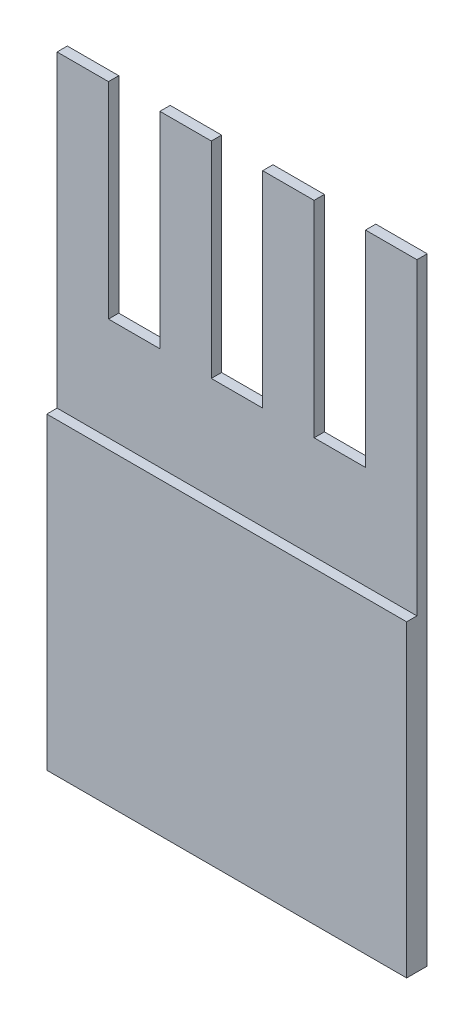
ISO-10303-21;
HEADER;
FILE_DESCRIPTION(('STEP AP214'),'2;1');
FILE_NAME('part.step','',(''),(''),'','','');
FILE_SCHEMA(('AUTOMOTIVE_DESIGN { 1 0 10303 214 1 1 1 1 }'));
ENDSEC;
DATA;
#1=APPLICATION_CONTEXT('core data for automotive mechanical design processes');
#2=APPLICATION_PROTOCOL_DEFINITION('international standard','automotive_design',2000,#1);
#3=PRODUCT_CONTEXT('',#1,'mechanical');
#4=PRODUCT('Part','Part','',(#3));
#5=PRODUCT_RELATED_PRODUCT_CATEGORY('part','',(#4));
#6=PRODUCT_DEFINITION_FORMATION('','',#4);
#7=PRODUCT_DEFINITION_CONTEXT('part definition',#1,'design');
#8=PRODUCT_DEFINITION('design','',#6,#7);
#9=PRODUCT_DEFINITION_SHAPE('','',#8);
#10=(LENGTH_UNIT() NAMED_UNIT(*) SI_UNIT(.MILLI.,.METRE.));
#11=(NAMED_UNIT(*) PLANE_ANGLE_UNIT() SI_UNIT($,.RADIAN.));
#12=(NAMED_UNIT(*) SI_UNIT($,.STERADIAN.) SOLID_ANGLE_UNIT());
#13=UNCERTAINTY_MEASURE_WITH_UNIT(LENGTH_MEASURE(1.E-05),#10,'distance_accuracy_value','');
#14=(GEOMETRIC_REPRESENTATION_CONTEXT(3) GLOBAL_UNCERTAINTY_ASSIGNED_CONTEXT((#13)) GLOBAL_UNIT_ASSIGNED_CONTEXT((#10,
#11,#12)) REPRESENTATION_CONTEXT('',''));
#15=CARTESIAN_POINT('',(0.,0.,0.));
#16=DIRECTION('',(0.,0.,1.));
#17=DIRECTION('',(1.,0.,0.));
#18=AXIS2_PLACEMENT_3D('',#15,#16,#17);
#19=CARTESIAN_POINT('',(0.,0.,2.));
#20=DIRECTION('',(0.,1.,0.));
#21=DIRECTION('',(0.,0.,1.));
#22=AXIS2_PLACEMENT_3D('',#19,#20,#21);
#23=PLANE('',#22);
#24=DIRECTION('',(1.,0.,0.));
#25=VECTOR('',#24,1.);
#26=CARTESIAN_POINT('',(0.,0.,1.));
#27=LINE('',#26,#25);
#28=CARTESIAN_POINT('',(-17.5,0.,1.));
#29=VERTEX_POINT('',#28);
#30=CARTESIAN_POINT('',(17.5,0.,1.));
#31=VERTEX_POINT('',#30);
#32=EDGE_CURVE('E49',#29,#31,#27,.T.);
#33=ORIENTED_EDGE('',*,*,#32,.F.);
#34=DIRECTION('',(0.,0.,-1.));
#35=VECTOR('',#34,1.);
#36=CARTESIAN_POINT('',(-17.5,0.,2.));
#37=LINE('',#36,#35);
#38=CARTESIAN_POINT('',(-17.5,0.,2.));
#39=VERTEX_POINT('',#38);
#40=EDGE_CURVE('E11',#39,#29,#37,.T.);
#41=ORIENTED_EDGE('',*,*,#40,.F.);
#42=DIRECTION('',(1.,0.,0.));
#43=VECTOR('',#42,1.);
#44=CARTESIAN_POINT('',(0.,0.,2.));
#45=LINE('',#44,#43);
#46=CARTESIAN_POINT('',(17.5,0.,2.));
#47=VERTEX_POINT('',#46);
#48=EDGE_CURVE('E160',#39,#47,#45,.T.);
#49=ORIENTED_EDGE('',*,*,#48,.T.);
#50=DIRECTION('',(0.,0.,-1.));
#51=VECTOR('',#50,1.);
#52=CARTESIAN_POINT('',(17.5,0.,2.));
#53=LINE('',#52,#51);
#54=EDGE_CURVE('E56',#47,#31,#53,.T.);
#55=ORIENTED_EDGE('',*,*,#54,.T.);
#56=EDGE_LOOP('',(#33,#41,#49,#55));
#57=FACE_BOUND('',#56,.T.);
#58=ADVANCED_FACE('F35',(#57),#23,.T.);
#59=CARTESIAN_POINT('',(-17.5,0.,2.));
#60=DIRECTION('',(1.,0.,0.));
#61=DIRECTION('',(0.,0.,-1.));
#62=AXIS2_PLACEMENT_3D('',#59,#60,#61);
#63=PLANE('',#62);
#64=DIRECTION('',(0.,-1.,0.));
#65=VECTOR('',#64,1.);
#66=CARTESIAN_POINT('',(-17.5,0.,0.));
#67=LINE('',#66,#65);
#68=CARTESIAN_POINT('',(-17.5,30.,0.));
#69=VERTEX_POINT('',#68);
#70=CARTESIAN_POINT('',(-17.5,-30.,0.));
#71=VERTEX_POINT('',#70);
#72=EDGE_CURVE('E280',#69,#71,#67,.T.);
#73=ORIENTED_EDGE('',*,*,#72,.T.);
#74=DIRECTION('',(0.,0.,-1.));
#75=VECTOR('',#74,1.);
#76=CARTESIAN_POINT('',(-17.5,-30.,2.));
#77=LINE('',#76,#75);
#78=CARTESIAN_POINT('',(-17.5,-30.,2.));
#79=VERTEX_POINT('',#78);
#80=EDGE_CURVE('E42',#79,#71,#77,.T.);
#81=ORIENTED_EDGE('',*,*,#80,.F.);
#82=DIRECTION('',(0.,-1.,0.));
#83=VECTOR('',#82,1.);
#84=CARTESIAN_POINT('',(-17.5,0.,2.));
#85=LINE('',#84,#83);
#86=EDGE_CURVE('E282',#39,#79,#85,.T.);
#87=ORIENTED_EDGE('',*,*,#86,.F.);
#88=ORIENTED_EDGE('',*,*,#40,.T.);
#89=DIRECTION('',(0.,-1.,0.));
#90=VECTOR('',#89,1.);
#91=CARTESIAN_POINT('',(-17.5,0.,1.));
#92=LINE('',#91,#90);
#93=CARTESIAN_POINT('',(-17.5,30.,1.));
#94=VERTEX_POINT('',#93);
#95=EDGE_CURVE('E170',#94,#29,#92,.T.);
#96=ORIENTED_EDGE('',*,*,#95,.F.);
#97=DIRECTION('',(0.,0.,-1.));
#98=VECTOR('',#97,1.);
#99=CARTESIAN_POINT('',(-17.5,30.,1.));
#100=LINE('',#99,#98);
#101=EDGE_CURVE('E213',#94,#69,#100,.T.);
#102=ORIENTED_EDGE('',*,*,#101,.T.);
#103=EDGE_LOOP('',(#73,#81,#87,#88,#96,#102));
#104=FACE_BOUND('',#103,.T.);
#105=ADVANCED_FACE('F301',(#104),#63,.F.);
#106=CARTESIAN_POINT('',(0.,-30.,2.));
#107=DIRECTION('',(0.,-1.,0.));
#108=DIRECTION('',(0.,0.,-1.));
#109=AXIS2_PLACEMENT_3D('',#106,#107,#108);
#110=PLANE('',#109);
#111=DIRECTION('',(-1.,0.,0.));
#112=VECTOR('',#111,1.);
#113=CARTESIAN_POINT('',(0.,-30.,0.));
#114=LINE('',#113,#112);
#115=CARTESIAN_POINT('',(17.5,-30.,0.));
#116=VERTEX_POINT('',#115);
#117=EDGE_CURVE('E291',#116,#71,#114,.T.);
#118=ORIENTED_EDGE('',*,*,#117,.F.);
#119=DIRECTION('',(0.,0.,-1.));
#120=VECTOR('',#119,1.);
#121=CARTESIAN_POINT('',(17.5,-30.,2.));
#122=LINE('',#121,#120);
#123=CARTESIAN_POINT('',(17.5,-30.,2.));
#124=VERTEX_POINT('',#123);
#125=EDGE_CURVE('E70',#124,#116,#122,.T.);
#126=ORIENTED_EDGE('',*,*,#125,.F.);
#127=DIRECTION('',(-1.,0.,0.));
#128=VECTOR('',#127,1.);
#129=CARTESIAN_POINT('',(0.,-30.,2.));
#130=LINE('',#129,#128);
#131=EDGE_CURVE('E285',#124,#79,#130,.T.);
#132=ORIENTED_EDGE('',*,*,#131,.T.);
#133=ORIENTED_EDGE('',*,*,#80,.T.);
#134=EDGE_LOOP('',(#118,#126,#132,#133));
#135=FACE_BOUND('',#134,.T.);
#136=ADVANCED_FACE('F298',(#135),#110,.T.);
#137=CARTESIAN_POINT('',(17.5,0.,2.));
#138=DIRECTION('',(1.,0.,0.));
#139=DIRECTION('',(0.,0.,-1.));
#140=AXIS2_PLACEMENT_3D('',#137,#138,#139);
#141=PLANE('',#140);
#142=DIRECTION('',(0.,-1.,0.));
#143=VECTOR('',#142,1.);
#144=CARTESIAN_POINT('',(17.5,0.,0.));
#145=LINE('',#144,#143);
#146=CARTESIAN_POINT('',(17.5,30.,0.));
#147=VERTEX_POINT('',#146);
#148=EDGE_CURVE('E283',#147,#116,#145,.T.);
#149=ORIENTED_EDGE('',*,*,#148,.F.);
#150=DIRECTION('',(0.,0.,-1.));
#151=VECTOR('',#150,1.);
#152=CARTESIAN_POINT('',(17.5,30.,1.));
#153=LINE('',#152,#151);
#154=CARTESIAN_POINT('',(17.5,30.,1.));
#155=VERTEX_POINT('',#154);
#156=EDGE_CURVE('E174',#155,#147,#153,.T.);
#157=ORIENTED_EDGE('',*,*,#156,.F.);
#158=DIRECTION('',(0.,-1.,0.));
#159=VECTOR('',#158,1.);
#160=CARTESIAN_POINT('',(17.5,0.,1.));
#161=LINE('',#160,#159);
#162=EDGE_CURVE('E168',#155,#31,#161,.T.);
#163=ORIENTED_EDGE('',*,*,#162,.T.);
#164=ORIENTED_EDGE('',*,*,#54,.F.);
#165=DIRECTION('',(0.,-1.,0.));
#166=VECTOR('',#165,1.);
#167=CARTESIAN_POINT('',(17.5,0.,2.));
#168=LINE('',#167,#166);
#169=EDGE_CURVE('E162',#47,#124,#168,.T.);
#170=ORIENTED_EDGE('',*,*,#169,.T.);
#171=ORIENTED_EDGE('',*,*,#125,.T.);
#172=EDGE_LOOP('',(#149,#157,#163,#164,#170,#171));
#173=FACE_BOUND('',#172,.T.);
#174=ADVANCED_FACE('F172',(#173),#141,.T.);
#175=CARTESIAN_POINT('',(0.,0.,2.));
#176=DIRECTION('',(0.,0.,1.));
#177=DIRECTION('',(1.,0.,0.));
#178=AXIS2_PLACEMENT_3D('',#175,#176,#177);
#179=PLANE('',#178);
#180=ORIENTED_EDGE('',*,*,#48,.F.);
#181=ORIENTED_EDGE('',*,*,#86,.T.);
#182=ORIENTED_EDGE('',*,*,#131,.F.);
#183=ORIENTED_EDGE('',*,*,#169,.F.);
#184=EDGE_LOOP('',(#180,#181,#182,#183));
#185=FACE_BOUND('',#184,.T.);
#186=ADVANCED_FACE('F360',(#185),#179,.T.);
#187=CARTESIAN_POINT('',(0.,0.,0.));
#188=DIRECTION('',(0.,0.,1.));
#189=DIRECTION('',(1.,0.,0.));
#190=AXIS2_PLACEMENT_3D('',#187,#188,#189);
#191=PLANE('',#190);
#192=ORIENTED_EDGE('',*,*,#72,.F.);
#193=DIRECTION('',(-1.,0.,0.));
#194=VECTOR('',#193,1.);
#195=CARTESIAN_POINT('',(0.,30.,0.));
#196=LINE('',#195,#194);
#197=CARTESIAN_POINT('',(-12.5,30.,0.));
#198=VERTEX_POINT('',#197);
#199=EDGE_CURVE('E249',#198,#69,#196,.T.);
#200=ORIENTED_EDGE('',*,*,#199,.F.);
#201=DIRECTION('',(0.,-1.,0.));
#202=VECTOR('',#201,1.);
#203=CARTESIAN_POINT('',(-12.5,0.,0.));
#204=LINE('',#203,#202);
#205=CARTESIAN_POINT('',(-12.5,10.,0.));
#206=VERTEX_POINT('',#205);
#207=EDGE_CURVE('E246',#198,#206,#204,.T.);
#208=ORIENTED_EDGE('',*,*,#207,.T.);
#209=DIRECTION('',(1.,0.,0.));
#210=VECTOR('',#209,1.);
#211=CARTESIAN_POINT('',(0.,10.,0.));
#212=LINE('',#211,#210);
#213=CARTESIAN_POINT('',(-7.5,10.,0.));
#214=VERTEX_POINT('',#213);
#215=EDGE_CURVE('E243',#206,#214,#212,.T.);
#216=ORIENTED_EDGE('',*,*,#215,.T.);
#217=DIRECTION('',(0.,-1.,0.));
#218=VECTOR('',#217,1.);
#219=CARTESIAN_POINT('',(-7.5,0.,0.));
#220=LINE('',#219,#218);
#221=CARTESIAN_POINT('',(-7.5,30.,0.));
#222=VERTEX_POINT('',#221);
#223=EDGE_CURVE('E240',#222,#214,#220,.T.);
#224=ORIENTED_EDGE('',*,*,#223,.F.);
#225=DIRECTION('',(1.,0.,0.));
#226=VECTOR('',#225,1.);
#227=CARTESIAN_POINT('',(0.,30.,0.));
#228=LINE('',#227,#226);
#229=CARTESIAN_POINT('',(-2.5,30.,0.));
#230=VERTEX_POINT('',#229);
#231=EDGE_CURVE('E237',#222,#230,#228,.T.);
#232=ORIENTED_EDGE('',*,*,#231,.T.);
#233=DIRECTION('',(0.,-1.,0.));
#234=VECTOR('',#233,1.);
#235=CARTESIAN_POINT('',(-2.5,0.,0.));
#236=LINE('',#235,#234);
#237=CARTESIAN_POINT('',(-2.5,10.,0.));
#238=VERTEX_POINT('',#237);
#239=EDGE_CURVE('E234',#230,#238,#236,.T.);
#240=ORIENTED_EDGE('',*,*,#239,.T.);
#241=DIRECTION('',(1.,0.,0.));
#242=VECTOR('',#241,1.);
#243=CARTESIAN_POINT('',(0.,10.,0.));
#244=LINE('',#243,#242);
#245=CARTESIAN_POINT('',(2.5,10.,0.));
#246=VERTEX_POINT('',#245);
#247=EDGE_CURVE('E231',#238,#246,#244,.T.);
#248=ORIENTED_EDGE('',*,*,#247,.T.);
#249=DIRECTION('',(0.,-1.,0.));
#250=VECTOR('',#249,1.);
#251=CARTESIAN_POINT('',(2.5,0.,0.));
#252=LINE('',#251,#250);
#253=CARTESIAN_POINT('',(2.5,30.,0.));
#254=VERTEX_POINT('',#253);
#255=EDGE_CURVE('E228',#254,#246,#252,.T.);
#256=ORIENTED_EDGE('',*,*,#255,.F.);
#257=DIRECTION('',(1.,0.,0.));
#258=VECTOR('',#257,1.);
#259=CARTESIAN_POINT('',(0.,30.,0.));
#260=LINE('',#259,#258);
#261=CARTESIAN_POINT('',(7.49999999999999,30.,0.));
#262=VERTEX_POINT('',#261);
#263=EDGE_CURVE('E225',#254,#262,#260,.T.);
#264=ORIENTED_EDGE('',*,*,#263,.T.);
#265=DIRECTION('',(0.,-1.,0.));
#266=VECTOR('',#265,1.);
#267=CARTESIAN_POINT('',(7.49999999999999,0.,0.));
#268=LINE('',#267,#266);
#269=CARTESIAN_POINT('',(7.49999999999999,10.,0.));
#270=VERTEX_POINT('',#269);
#271=EDGE_CURVE('E222',#262,#270,#268,.T.);
#272=ORIENTED_EDGE('',*,*,#271,.T.);
#273=DIRECTION('',(1.,0.,0.));
#274=VECTOR('',#273,1.);
#275=CARTESIAN_POINT('',(0.,10.,0.));
#276=LINE('',#275,#274);
#277=CARTESIAN_POINT('',(12.5,10.,0.));
#278=VERTEX_POINT('',#277);
#279=EDGE_CURVE('E219',#270,#278,#276,.T.);
#280=ORIENTED_EDGE('',*,*,#279,.T.);
#281=DIRECTION('',(0.,-1.,0.));
#282=VECTOR('',#281,1.);
#283=CARTESIAN_POINT('',(12.5,0.,0.));
#284=LINE('',#283,#282);
#285=CARTESIAN_POINT('',(12.5,30.,0.));
#286=VERTEX_POINT('',#285);
#287=EDGE_CURVE('E216',#286,#278,#284,.T.);
#288=ORIENTED_EDGE('',*,*,#287,.F.);
#289=DIRECTION('',(-1.,0.,0.));
#290=VECTOR('',#289,1.);
#291=CARTESIAN_POINT('',(0.,30.,0.));
#292=LINE('',#291,#290);
#293=EDGE_CURVE('E214',#147,#286,#292,.T.);
#294=ORIENTED_EDGE('',*,*,#293,.F.);
#295=ORIENTED_EDGE('',*,*,#148,.T.);
#296=ORIENTED_EDGE('',*,*,#117,.T.);
#297=EDGE_LOOP('',(#192,#200,#208,#216,#224,#232,#240,#248,#256,#264,#272,#280,#288,#294,#295,#296));
#298=FACE_BOUND('',#297,.T.);
#299=ADVANCED_FACE('F305',(#298),#191,.F.);
#300=CARTESIAN_POINT('',(0.,30.,1.));
#301=DIRECTION('',(0.,-1.,0.));
#302=DIRECTION('',(0.,0.,-1.));
#303=AXIS2_PLACEMENT_3D('',#300,#301,#302);
#304=PLANE('',#303);
#305=ORIENTED_EDGE('',*,*,#293,.T.);
#306=DIRECTION('',(0.,0.,-1.));
#307=VECTOR('',#306,1.);
#308=CARTESIAN_POINT('',(12.5,30.,1.));
#309=LINE('',#308,#307);
#310=CARTESIAN_POINT('',(12.5,30.,1.));
#311=VERTEX_POINT('',#310);
#312=EDGE_CURVE('E276',#311,#286,#309,.T.);
#313=ORIENTED_EDGE('',*,*,#312,.F.);
#314=DIRECTION('',(-1.,0.,0.));
#315=VECTOR('',#314,1.);
#316=CARTESIAN_POINT('',(0.,30.,1.));
#317=LINE('',#316,#315);
#318=EDGE_CURVE('E176',#155,#311,#317,.T.);
#319=ORIENTED_EDGE('',*,*,#318,.F.);
#320=ORIENTED_EDGE('',*,*,#156,.T.);
#321=EDGE_LOOP('',(#305,#313,#319,#320));
#322=FACE_BOUND('',#321,.T.);
#323=ADVANCED_FACE('F309',(#322),#304,.F.);
#324=CARTESIAN_POINT('',(12.5,0.,1.));
#325=DIRECTION('',(1.,0.,0.));
#326=DIRECTION('',(0.,1.,0.));
#327=AXIS2_PLACEMENT_3D('',#324,#325,#326);
#328=PLANE('',#327);
#329=ORIENTED_EDGE('',*,*,#287,.T.);
#330=DIRECTION('',(0.,0.,-1.));
#331=VECTOR('',#330,1.);
#332=CARTESIAN_POINT('',(12.5,10.,1.));
#333=LINE('',#332,#331);
#334=CARTESIAN_POINT('',(12.5,10.,1.));
#335=VERTEX_POINT('',#334);
#336=EDGE_CURVE('E274',#335,#278,#333,.T.);
#337=ORIENTED_EDGE('',*,*,#336,.F.);
#338=DIRECTION('',(0.,-1.,0.));
#339=VECTOR('',#338,1.);
#340=CARTESIAN_POINT('',(12.5,0.,1.));
#341=LINE('',#340,#339);
#342=EDGE_CURVE('E178',#311,#335,#341,.T.);
#343=ORIENTED_EDGE('',*,*,#342,.F.);
#344=ORIENTED_EDGE('',*,*,#312,.T.);
#345=EDGE_LOOP('',(#329,#337,#343,#344));
#346=FACE_BOUND('',#345,.T.);
#347=ADVANCED_FACE('F316',(#346),#328,.F.);
#348=CARTESIAN_POINT('',(0.,10.,1.));
#349=DIRECTION('',(0.,1.,0.));
#350=DIRECTION('',(0.,0.,1.));
#351=AXIS2_PLACEMENT_3D('',#348,#349,#350);
#352=PLANE('',#351);
#353=ORIENTED_EDGE('',*,*,#279,.F.);
#354=DIRECTION('',(0.,0.,-1.));
#355=VECTOR('',#354,1.);
#356=CARTESIAN_POINT('',(7.49999999999999,10.,1.));
#357=LINE('',#356,#355);
#358=CARTESIAN_POINT('',(7.49999999999999,10.,1.));
#359=VERTEX_POINT('',#358);
#360=EDGE_CURVE('E272',#359,#270,#357,.T.);
#361=ORIENTED_EDGE('',*,*,#360,.F.);
#362=DIRECTION('',(1.,0.,0.));
#363=VECTOR('',#362,1.);
#364=CARTESIAN_POINT('',(0.,10.,1.));
#365=LINE('',#364,#363);
#366=EDGE_CURVE('E183',#359,#335,#365,.T.);
#367=ORIENTED_EDGE('',*,*,#366,.T.);
#368=ORIENTED_EDGE('',*,*,#336,.T.);
#369=EDGE_LOOP('',(#353,#361,#367,#368));
#370=FACE_BOUND('',#369,.T.);
#371=ADVANCED_FACE('F319',(#370),#352,.T.);
#372=CARTESIAN_POINT('',(7.49999999999999,0.,1.));
#373=DIRECTION('',(1.,0.,0.));
#374=DIRECTION('',(0.,0.,-1.));
#375=AXIS2_PLACEMENT_3D('',#372,#373,#374);
#376=PLANE('',#375);
#377=ORIENTED_EDGE('',*,*,#271,.F.);
#378=DIRECTION('',(0.,0.,-1.));
#379=VECTOR('',#378,1.);
#380=CARTESIAN_POINT('',(7.49999999999999,30.,1.));
#381=LINE('',#380,#379);
#382=CARTESIAN_POINT('',(7.49999999999999,30.,1.));
#383=VERTEX_POINT('',#382);
#384=EDGE_CURVE('E270',#383,#262,#381,.T.);
#385=ORIENTED_EDGE('',*,*,#384,.F.);
#386=DIRECTION('',(0.,-1.,0.));
#387=VECTOR('',#386,1.);
#388=CARTESIAN_POINT('',(7.49999999999999,0.,1.));
#389=LINE('',#388,#387);
#390=EDGE_CURVE('E186',#383,#359,#389,.T.);
#391=ORIENTED_EDGE('',*,*,#390,.T.);
#392=ORIENTED_EDGE('',*,*,#360,.T.);
#393=EDGE_LOOP('',(#377,#385,#391,#392));
#394=FACE_BOUND('',#393,.T.);
#395=ADVANCED_FACE('F322',(#394),#376,.T.);
#396=CARTESIAN_POINT('',(0.,30.,1.));
#397=DIRECTION('',(0.,1.,0.));
#398=DIRECTION('',(0.,0.,1.));
#399=AXIS2_PLACEMENT_3D('',#396,#397,#398);
#400=PLANE('',#399);
#401=ORIENTED_EDGE('',*,*,#263,.F.);
#402=DIRECTION('',(0.,0.,-1.));
#403=VECTOR('',#402,1.);
#404=CARTESIAN_POINT('',(2.5,30.,1.));
#405=LINE('',#404,#403);
#406=CARTESIAN_POINT('',(2.5,30.,1.));
#407=VERTEX_POINT('',#406);
#408=EDGE_CURVE('E268',#407,#254,#405,.T.);
#409=ORIENTED_EDGE('',*,*,#408,.F.);
#410=DIRECTION('',(1.,0.,0.));
#411=VECTOR('',#410,1.);
#412=CARTESIAN_POINT('',(0.,30.,1.));
#413=LINE('',#412,#411);
#414=EDGE_CURVE('E189',#407,#383,#413,.T.);
#415=ORIENTED_EDGE('',*,*,#414,.T.);
#416=ORIENTED_EDGE('',*,*,#384,.T.);
#417=EDGE_LOOP('',(#401,#409,#415,#416));
#418=FACE_BOUND('',#417,.T.);
#419=ADVANCED_FACE('F326',(#418),#400,.T.);
#420=CARTESIAN_POINT('',(2.5,0.,1.));
#421=DIRECTION('',(1.,0.,0.));
#422=DIRECTION('',(0.,1.,0.));
#423=AXIS2_PLACEMENT_3D('',#420,#421,#422);
#424=PLANE('',#423);
#425=ORIENTED_EDGE('',*,*,#255,.T.);
#426=DIRECTION('',(0.,0.,-1.));
#427=VECTOR('',#426,1.);
#428=CARTESIAN_POINT('',(2.5,10.,1.));
#429=LINE('',#428,#427);
#430=CARTESIAN_POINT('',(2.5,10.,1.));
#431=VERTEX_POINT('',#430);
#432=EDGE_CURVE('E266',#431,#246,#429,.T.);
#433=ORIENTED_EDGE('',*,*,#432,.F.);
#434=DIRECTION('',(0.,-1.,0.));
#435=VECTOR('',#434,1.);
#436=CARTESIAN_POINT('',(2.5,0.,1.));
#437=LINE('',#436,#435);
#438=EDGE_CURVE('E192',#407,#431,#437,.T.);
#439=ORIENTED_EDGE('',*,*,#438,.F.);
#440=ORIENTED_EDGE('',*,*,#408,.T.);
#441=EDGE_LOOP('',(#425,#433,#439,#440));
#442=FACE_BOUND('',#441,.T.);
#443=ADVANCED_FACE('F331',(#442),#424,.F.);
#444=CARTESIAN_POINT('',(0.,10.,1.));
#445=DIRECTION('',(0.,1.,0.));
#446=DIRECTION('',(0.,0.,1.));
#447=AXIS2_PLACEMENT_3D('',#444,#445,#446);
#448=PLANE('',#447);
#449=ORIENTED_EDGE('',*,*,#247,.F.);
#450=DIRECTION('',(0.,0.,-1.));
#451=VECTOR('',#450,1.);
#452=CARTESIAN_POINT('',(-2.5,10.,1.));
#453=LINE('',#452,#451);
#454=CARTESIAN_POINT('',(-2.5,10.,1.));
#455=VERTEX_POINT('',#454);
#456=EDGE_CURVE('E264',#455,#238,#453,.T.);
#457=ORIENTED_EDGE('',*,*,#456,.F.);
#458=DIRECTION('',(1.,0.,0.));
#459=VECTOR('',#458,1.);
#460=CARTESIAN_POINT('',(0.,10.,1.));
#461=LINE('',#460,#459);
#462=EDGE_CURVE('E194',#455,#431,#461,.T.);
#463=ORIENTED_EDGE('',*,*,#462,.T.);
#464=ORIENTED_EDGE('',*,*,#432,.T.);
#465=EDGE_LOOP('',(#449,#457,#463,#464));
#466=FACE_BOUND('',#465,.T.);
#467=ADVANCED_FACE('F446',(#466),#448,.T.);
#468=CARTESIAN_POINT('',(-2.5,0.,1.));
#469=DIRECTION('',(1.,0.,0.));
#470=DIRECTION('',(0.,1.,0.));
#471=AXIS2_PLACEMENT_3D('',#468,#469,#470);
#472=PLANE('',#471);
#473=ORIENTED_EDGE('',*,*,#239,.F.);
#474=DIRECTION('',(0.,0.,-1.));
#475=VECTOR('',#474,1.);
#476=CARTESIAN_POINT('',(-2.5,30.,1.));
#477=LINE('',#476,#475);
#478=CARTESIAN_POINT('',(-2.5,30.,1.));
#479=VERTEX_POINT('',#478);
#480=EDGE_CURVE('E262',#479,#230,#477,.T.);
#481=ORIENTED_EDGE('',*,*,#480,.F.);
#482=DIRECTION('',(0.,-1.,0.));
#483=VECTOR('',#482,1.);
#484=CARTESIAN_POINT('',(-2.5,0.,1.));
#485=LINE('',#484,#483);
#486=EDGE_CURVE('E197',#479,#455,#485,.T.);
#487=ORIENTED_EDGE('',*,*,#486,.T.);
#488=ORIENTED_EDGE('',*,*,#456,.T.);
#489=EDGE_LOOP('',(#473,#481,#487,#488));
#490=FACE_BOUND('',#489,.T.);
#491=ADVANCED_FACE('F338',(#490),#472,.T.);
#492=CARTESIAN_POINT('',(0.,30.,1.));
#493=DIRECTION('',(0.,1.,0.));
#494=DIRECTION('',(0.,0.,1.));
#495=AXIS2_PLACEMENT_3D('',#492,#493,#494);
#496=PLANE('',#495);
#497=ORIENTED_EDGE('',*,*,#231,.F.);
#498=DIRECTION('',(0.,0.,-1.));
#499=VECTOR('',#498,1.);
#500=CARTESIAN_POINT('',(-7.5,30.,1.));
#501=LINE('',#500,#499);
#502=CARTESIAN_POINT('',(-7.5,30.,1.));
#503=VERTEX_POINT('',#502);
#504=EDGE_CURVE('E260',#503,#222,#501,.T.);
#505=ORIENTED_EDGE('',*,*,#504,.F.);
#506=DIRECTION('',(1.,0.,0.));
#507=VECTOR('',#506,1.);
#508=CARTESIAN_POINT('',(0.,30.,1.));
#509=LINE('',#508,#507);
#510=EDGE_CURVE('E200',#503,#479,#509,.T.);
#511=ORIENTED_EDGE('',*,*,#510,.T.);
#512=ORIENTED_EDGE('',*,*,#480,.T.);
#513=EDGE_LOOP('',(#497,#505,#511,#512));
#514=FACE_BOUND('',#513,.T.);
#515=ADVANCED_FACE('F342',(#514),#496,.T.);
#516=CARTESIAN_POINT('',(-7.5,0.,1.));
#517=DIRECTION('',(1.,0.,0.));
#518=DIRECTION('',(0.,1.,0.));
#519=AXIS2_PLACEMENT_3D('',#516,#517,#518);
#520=PLANE('',#519);
#521=ORIENTED_EDGE('',*,*,#223,.T.);
#522=DIRECTION('',(0.,0.,-1.));
#523=VECTOR('',#522,1.);
#524=CARTESIAN_POINT('',(-7.5,10.,1.));
#525=LINE('',#524,#523);
#526=CARTESIAN_POINT('',(-7.5,10.,1.));
#527=VERTEX_POINT('',#526);
#528=EDGE_CURVE('E258',#527,#214,#525,.T.);
#529=ORIENTED_EDGE('',*,*,#528,.F.);
#530=DIRECTION('',(0.,-1.,0.));
#531=VECTOR('',#530,1.);
#532=CARTESIAN_POINT('',(-7.5,0.,1.));
#533=LINE('',#532,#531);
#534=EDGE_CURVE('E203',#503,#527,#533,.T.);
#535=ORIENTED_EDGE('',*,*,#534,.F.);
#536=ORIENTED_EDGE('',*,*,#504,.T.);
#537=EDGE_LOOP('',(#521,#529,#535,#536));
#538=FACE_BOUND('',#537,.T.);
#539=ADVANCED_FACE('F348',(#538),#520,.F.);
#540=CARTESIAN_POINT('',(0.,10.,1.));
#541=DIRECTION('',(0.,1.,0.));
#542=DIRECTION('',(0.,0.,1.));
#543=AXIS2_PLACEMENT_3D('',#540,#541,#542);
#544=PLANE('',#543);
#545=ORIENTED_EDGE('',*,*,#215,.F.);
#546=DIRECTION('',(0.,0.,-1.));
#547=VECTOR('',#546,1.);
#548=CARTESIAN_POINT('',(-12.5,10.,1.));
#549=LINE('',#548,#547);
#550=CARTESIAN_POINT('',(-12.5,10.,1.));
#551=VERTEX_POINT('',#550);
#552=EDGE_CURVE('E256',#551,#206,#549,.T.);
#553=ORIENTED_EDGE('',*,*,#552,.F.);
#554=DIRECTION('',(1.,0.,0.));
#555=VECTOR('',#554,1.);
#556=CARTESIAN_POINT('',(0.,10.,1.));
#557=LINE('',#556,#555);
#558=EDGE_CURVE('E205',#551,#527,#557,.T.);
#559=ORIENTED_EDGE('',*,*,#558,.T.);
#560=ORIENTED_EDGE('',*,*,#528,.T.);
#561=EDGE_LOOP('',(#545,#553,#559,#560));
#562=FACE_BOUND('',#561,.T.);
#563=ADVANCED_FACE('F352',(#562),#544,.T.);
#564=CARTESIAN_POINT('',(-12.5,0.,1.));
#565=DIRECTION('',(1.,0.,0.));
#566=DIRECTION('',(0.,1.,0.));
#567=AXIS2_PLACEMENT_3D('',#564,#565,#566);
#568=PLANE('',#567);
#569=ORIENTED_EDGE('',*,*,#207,.F.);
#570=DIRECTION('',(0.,0.,-1.));
#571=VECTOR('',#570,1.);
#572=CARTESIAN_POINT('',(-12.5,30.,1.));
#573=LINE('',#572,#571);
#574=CARTESIAN_POINT('',(-12.5,30.,1.));
#575=VERTEX_POINT('',#574);
#576=EDGE_CURVE('E254',#575,#198,#573,.T.);
#577=ORIENTED_EDGE('',*,*,#576,.F.);
#578=DIRECTION('',(0.,-1.,0.));
#579=VECTOR('',#578,1.);
#580=CARTESIAN_POINT('',(-12.5,0.,1.));
#581=LINE('',#580,#579);
#582=EDGE_CURVE('E208',#575,#551,#581,.T.);
#583=ORIENTED_EDGE('',*,*,#582,.T.);
#584=ORIENTED_EDGE('',*,*,#552,.T.);
#585=EDGE_LOOP('',(#569,#577,#583,#584));
#586=FACE_BOUND('',#585,.T.);
#587=ADVANCED_FACE('F355',(#586),#568,.T.);
#588=CARTESIAN_POINT('',(0.,30.,1.));
#589=DIRECTION('',(0.,-1.,0.));
#590=DIRECTION('',(0.,0.,-1.));
#591=AXIS2_PLACEMENT_3D('',#588,#589,#590);
#592=PLANE('',#591);
#593=ORIENTED_EDGE('',*,*,#199,.T.);
#594=ORIENTED_EDGE('',*,*,#101,.F.);
#595=DIRECTION('',(-1.,0.,0.));
#596=VECTOR('',#595,1.);
#597=CARTESIAN_POINT('',(0.,30.,1.));
#598=LINE('',#597,#596);
#599=EDGE_CURVE('E211',#575,#94,#598,.T.);
#600=ORIENTED_EDGE('',*,*,#599,.F.);
#601=ORIENTED_EDGE('',*,*,#576,.T.);
#602=EDGE_LOOP('',(#593,#594,#600,#601));
#603=FACE_BOUND('',#602,.T.);
#604=ADVANCED_FACE('F358',(#603),#592,.F.);
#605=CARTESIAN_POINT('',(0.,0.,1.));
#606=DIRECTION('',(0.,0.,1.));
#607=DIRECTION('',(1.,0.,0.));
#608=AXIS2_PLACEMENT_3D('',#605,#606,#607);
#609=PLANE('',#608);
#610=ORIENTED_EDGE('',*,*,#95,.T.);
#611=ORIENTED_EDGE('',*,*,#32,.T.);
#612=ORIENTED_EDGE('',*,*,#162,.F.);
#613=ORIENTED_EDGE('',*,*,#318,.T.);
#614=ORIENTED_EDGE('',*,*,#342,.T.);
#615=ORIENTED_EDGE('',*,*,#366,.F.);
#616=ORIENTED_EDGE('',*,*,#390,.F.);
#617=ORIENTED_EDGE('',*,*,#414,.F.);
#618=ORIENTED_EDGE('',*,*,#438,.T.);
#619=ORIENTED_EDGE('',*,*,#462,.F.);
#620=ORIENTED_EDGE('',*,*,#486,.F.);
#621=ORIENTED_EDGE('',*,*,#510,.F.);
#622=ORIENTED_EDGE('',*,*,#534,.T.);
#623=ORIENTED_EDGE('',*,*,#558,.F.);
#624=ORIENTED_EDGE('',*,*,#582,.F.);
#625=ORIENTED_EDGE('',*,*,#599,.T.);
#626=EDGE_LOOP('',(#610,#611,#612,#613,#614,#615,#616,#617,#618,#619,#620,#621,#622,#623,#624,#625));
#627=FACE_BOUND('',#626,.T.);
#628=ADVANCED_FACE('F167',(#627),#609,.T.);
#629=CLOSED_SHELL('',(#58,#105,#136,#174,#186,#299,#323,#347,#371,#395,#419,#443,#467,#491,#515,
#539,#563,#587,#604,#628));
#630=MANIFOLD_SOLID_BREP('B2',#629);
#631=ADVANCED_BREP_SHAPE_REPRESENTATION('',(#18,#630),#14);
#632=SHAPE_DEFINITION_REPRESENTATION(#9,#631);
ENDSEC;
END-ISO-10303-21;
